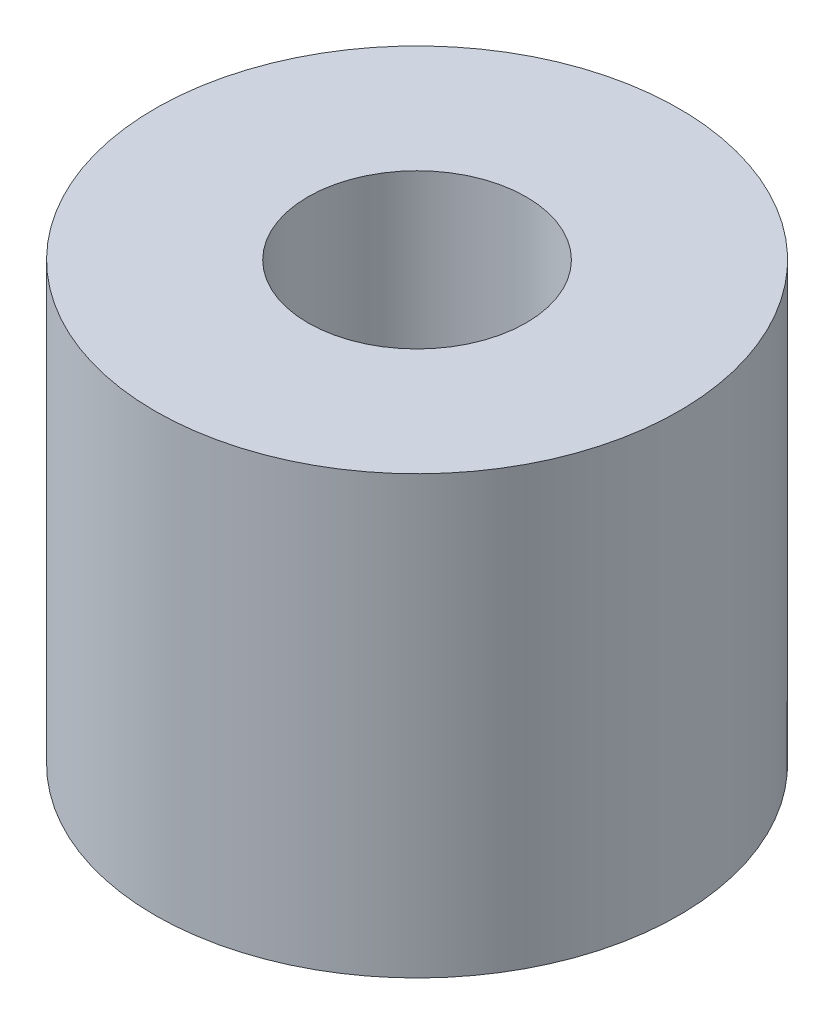
ISO-10303-21;
HEADER;
FILE_DESCRIPTION(('STEP AP214'),'2;1');
FILE_NAME('part.step','',(''),(''),'','','');
FILE_SCHEMA(('AUTOMOTIVE_DESIGN { 1 0 10303 214 1 1 1 1 }'));
ENDSEC;
DATA;
#1=APPLICATION_CONTEXT('core data for automotive mechanical design processes');
#2=APPLICATION_PROTOCOL_DEFINITION('international standard','automotive_design',2000,#1);
#3=PRODUCT_CONTEXT('',#1,'mechanical');
#4=PRODUCT('Part','Part','',(#3));
#5=PRODUCT_RELATED_PRODUCT_CATEGORY('part','',(#4));
#6=PRODUCT_DEFINITION_FORMATION('','',#4);
#7=PRODUCT_DEFINITION_CONTEXT('part definition',#1,'design');
#8=PRODUCT_DEFINITION('design','',#6,#7);
#9=PRODUCT_DEFINITION_SHAPE('','',#8);
#10=(LENGTH_UNIT() NAMED_UNIT(*) SI_UNIT(.MILLI.,.METRE.));
#11=(NAMED_UNIT(*) PLANE_ANGLE_UNIT() SI_UNIT($,.RADIAN.));
#12=(NAMED_UNIT(*) SI_UNIT($,.STERADIAN.) SOLID_ANGLE_UNIT());
#13=UNCERTAINTY_MEASURE_WITH_UNIT(LENGTH_MEASURE(1.E-05),#10,'distance_accuracy_value','');
#14=(GEOMETRIC_REPRESENTATION_CONTEXT(3) GLOBAL_UNCERTAINTY_ASSIGNED_CONTEXT((#13)) GLOBAL_UNIT_ASSIGNED_CONTEXT((#10,
#11,#12)) REPRESENTATION_CONTEXT('',''));
#15=CARTESIAN_POINT('',(0.,0.,0.));
#16=DIRECTION('',(0.,0.,1.));
#17=DIRECTION('',(1.,0.,0.));
#18=AXIS2_PLACEMENT_3D('',#15,#16,#17);
#19=CARTESIAN_POINT('',(0.,5.,0.));
#20=DIRECTION('',(0.,1.,0.));
#21=DIRECTION('',(0.,0.,1.));
#22=AXIS2_PLACEMENT_3D('',#19,#20,#21);
#23=PLANE('',#22);
#24=CARTESIAN_POINT('',(0.,5.,0.));
#25=DIRECTION('',(0.,1.,0.));
#26=DIRECTION('',(0.,0.,1.));
#27=AXIS2_PLACEMENT_3D('',#24,#25,#26);
#28=CIRCLE('',#27,3.);
#29=CARTESIAN_POINT('',(0.,5.,3.));
#30=VERTEX_POINT('',#29);
#31=EDGE_CURVE('E10',#30,#30,#28,.T.);
#32=ORIENTED_EDGE('',*,*,#31,.T.);
#33=EDGE_LOOP('',(#32));
#34=FACE_BOUND('',#33,.T.);
#35=CARTESIAN_POINT('',(0.,5.,0.));
#36=DIRECTION('',(0.,1.,0.));
#37=DIRECTION('',(0.,0.,1.));
#38=AXIS2_PLACEMENT_3D('',#35,#36,#37);
#39=CIRCLE('',#38,1.25);
#40=CARTESIAN_POINT('',(0.,5.,1.25));
#41=VERTEX_POINT('',#40);
#42=EDGE_CURVE('E43',#41,#41,#39,.T.);
#43=ORIENTED_EDGE('',*,*,#42,.F.);
#44=EDGE_LOOP('',(#43));
#45=FACE_BOUND('',#44,.T.);
#46=ADVANCED_FACE('F32',(#34,#45),#23,.T.);
#47=CARTESIAN_POINT('',(0.,0.,0.));
#48=DIRECTION('',(0.,1.,0.));
#49=DIRECTION('',(0.,0.,1.));
#50=AXIS2_PLACEMENT_3D('',#47,#48,#49);
#51=PLANE('',#50);
#52=CARTESIAN_POINT('',(0.,0.,0.));
#53=DIRECTION('',(0.,1.,0.));
#54=DIRECTION('',(0.,0.,1.));
#55=AXIS2_PLACEMENT_3D('',#52,#53,#54);
#56=CIRCLE('',#55,3.);
#57=CARTESIAN_POINT('',(0.,0.,3.));
#58=VERTEX_POINT('',#57);
#59=EDGE_CURVE('E36',#58,#58,#56,.T.);
#60=ORIENTED_EDGE('',*,*,#59,.F.);
#61=EDGE_LOOP('',(#60));
#62=FACE_BOUND('',#61,.T.);
#63=CARTESIAN_POINT('',(0.,0.,0.));
#64=DIRECTION('',(0.,1.,0.));
#65=DIRECTION('',(0.,0.,1.));
#66=AXIS2_PLACEMENT_3D('',#63,#64,#65);
#67=CIRCLE('',#66,1.25);
#68=CARTESIAN_POINT('',(0.,0.,1.25));
#69=VERTEX_POINT('',#68);
#70=EDGE_CURVE('E45',#69,#69,#67,.T.);
#71=ORIENTED_EDGE('',*,*,#70,.T.);
#72=EDGE_LOOP('',(#71));
#73=FACE_BOUND('',#72,.T.);
#74=ADVANCED_FACE('F55',(#62,#73),#51,.F.);
#75=CARTESIAN_POINT('',(0.,5.,0.));
#76=DIRECTION('',(0.,-1.,0.));
#77=DIRECTION('',(0.,0.,-1.));
#78=AXIS2_PLACEMENT_3D('',#75,#76,#77);
#79=CYLINDRICAL_SURFACE('',#78,3.);
#80=ORIENTED_EDGE('',*,*,#31,.F.);
#81=EDGE_LOOP('',(#80));
#82=FACE_BOUND('',#81,.T.);
#83=ORIENTED_EDGE('',*,*,#59,.T.);
#84=EDGE_LOOP('',(#83));
#85=FACE_BOUND('',#84,.T.);
#86=ADVANCED_FACE('F34',(#82,#85),#79,.T.);
#87=CARTESIAN_POINT('',(0.,5.,0.));
#88=DIRECTION('',(0.,-1.,0.));
#89=DIRECTION('',(0.,0.,-1.));
#90=AXIS2_PLACEMENT_3D('',#87,#88,#89);
#91=CYLINDRICAL_SURFACE('',#90,1.25);
#92=ORIENTED_EDGE('',*,*,#42,.T.);
#93=EDGE_LOOP('',(#92));
#94=FACE_BOUND('',#93,.T.);
#95=ORIENTED_EDGE('',*,*,#70,.F.);
#96=EDGE_LOOP('',(#95));
#97=FACE_BOUND('',#96,.T.);
#98=ADVANCED_FACE('F51',(#94,#97),#91,.F.);
#99=CLOSED_SHELL('',(#46,#74,#86,#98));
#100=MANIFOLD_SOLID_BREP('B2',#99);
#101=ADVANCED_BREP_SHAPE_REPRESENTATION('',(#18,#100),#14);
#102=SHAPE_DEFINITION_REPRESENTATION(#9,#101);
ENDSEC;
END-ISO-10303-21;
